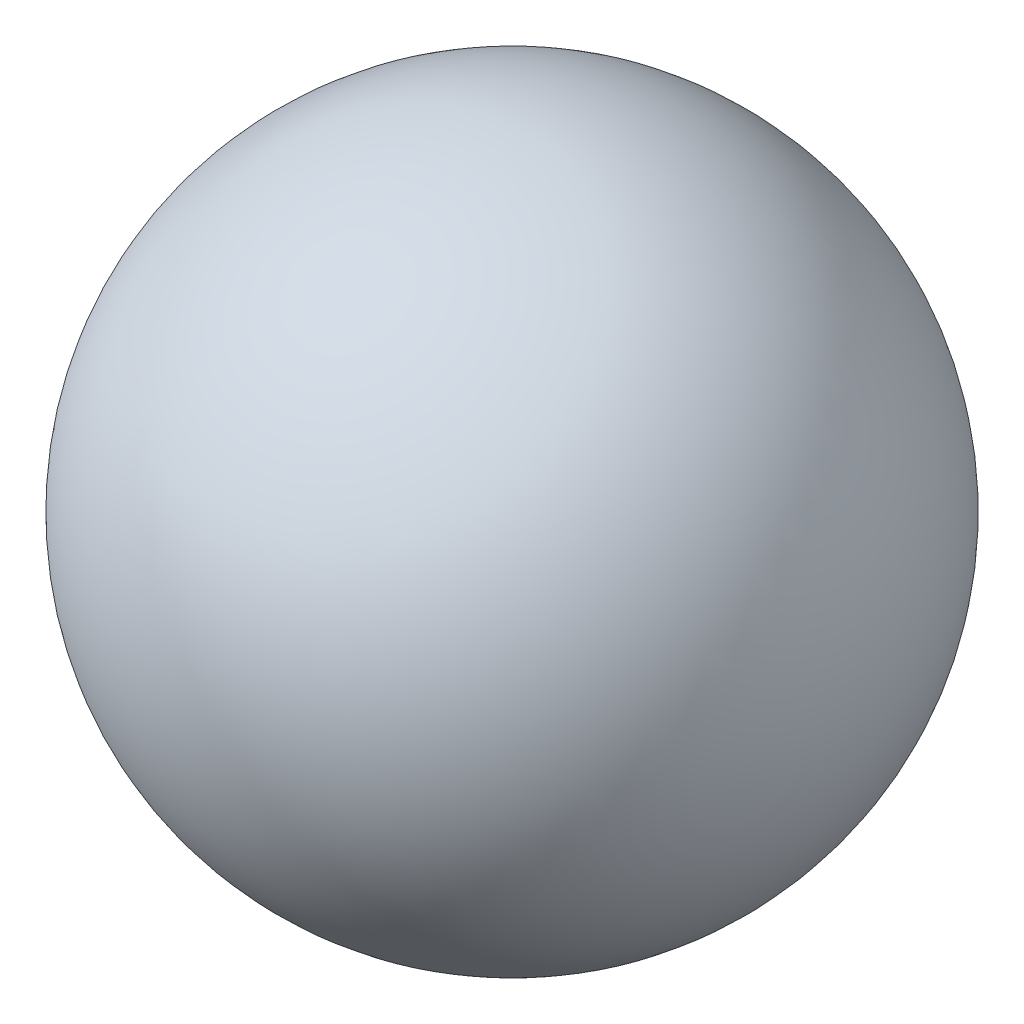
ISO-10303-21;
HEADER;
FILE_DESCRIPTION(('STEP AP214'),'2;1');
FILE_NAME('part.step','',(''),(''),'','','');
FILE_SCHEMA(('AUTOMOTIVE_DESIGN { 1 0 10303 214 1 1 1 1 }'));
ENDSEC;
DATA;
#1=APPLICATION_CONTEXT('core data for automotive mechanical design processes');
#2=APPLICATION_PROTOCOL_DEFINITION('international standard','automotive_design',2000,#1);
#3=PRODUCT_CONTEXT('',#1,'mechanical');
#4=PRODUCT('Part','Part','',(#3));
#5=PRODUCT_RELATED_PRODUCT_CATEGORY('part','',(#4));
#6=PRODUCT_DEFINITION_FORMATION('','',#4);
#7=PRODUCT_DEFINITION_CONTEXT('part definition',#1,'design');
#8=PRODUCT_DEFINITION('design','',#6,#7);
#9=PRODUCT_DEFINITION_SHAPE('','',#8);
#10=(LENGTH_UNIT() NAMED_UNIT(*) SI_UNIT(.MILLI.,.METRE.));
#11=(NAMED_UNIT(*) PLANE_ANGLE_UNIT() SI_UNIT($,.RADIAN.));
#12=(NAMED_UNIT(*) SI_UNIT($,.STERADIAN.) SOLID_ANGLE_UNIT());
#13=UNCERTAINTY_MEASURE_WITH_UNIT(LENGTH_MEASURE(1.E-05),#10,'distance_accuracy_value','');
#14=(GEOMETRIC_REPRESENTATION_CONTEXT(3) GLOBAL_UNCERTAINTY_ASSIGNED_CONTEXT((#13)) GLOBAL_UNIT_ASSIGNED_CONTEXT((#10,
#11,#12)) REPRESENTATION_CONTEXT('',''));
#15=CARTESIAN_POINT('',(0.,0.,0.));
#16=DIRECTION('',(0.,0.,1.));
#17=DIRECTION('',(1.,0.,0.));
#18=AXIS2_PLACEMENT_3D('',#15,#16,#17);
#19=CARTESIAN_POINT('',(0.,0.,0.));
#20=DIRECTION('',(0.,1.,0.));
#21=DIRECTION('',(1.,0.,0.));
#22=AXIS2_PLACEMENT_3D('',#19,#20,#21);
#23=SPHERICAL_SURFACE('',#22,0.330200000000003);
#24=CARTESIAN_POINT('',(0.,0.330200000000003,0.));
#25=VERTEX_POINT('',#24);
#26=VERTEX_LOOP('',#25);
#27=FACE_BOUND('',#26,.T.);
#28=ADVANCED_FACE('F32',(#27),#23,.T.);
#29=CLOSED_SHELL('',(#28));
#30=MANIFOLD_SOLID_BREP('B2',#29);
#31=ADVANCED_BREP_SHAPE_REPRESENTATION('',(#18,#30),#14);
#32=SHAPE_DEFINITION_REPRESENTATION(#9,#31);
ENDSEC;
END-ISO-10303-21;
